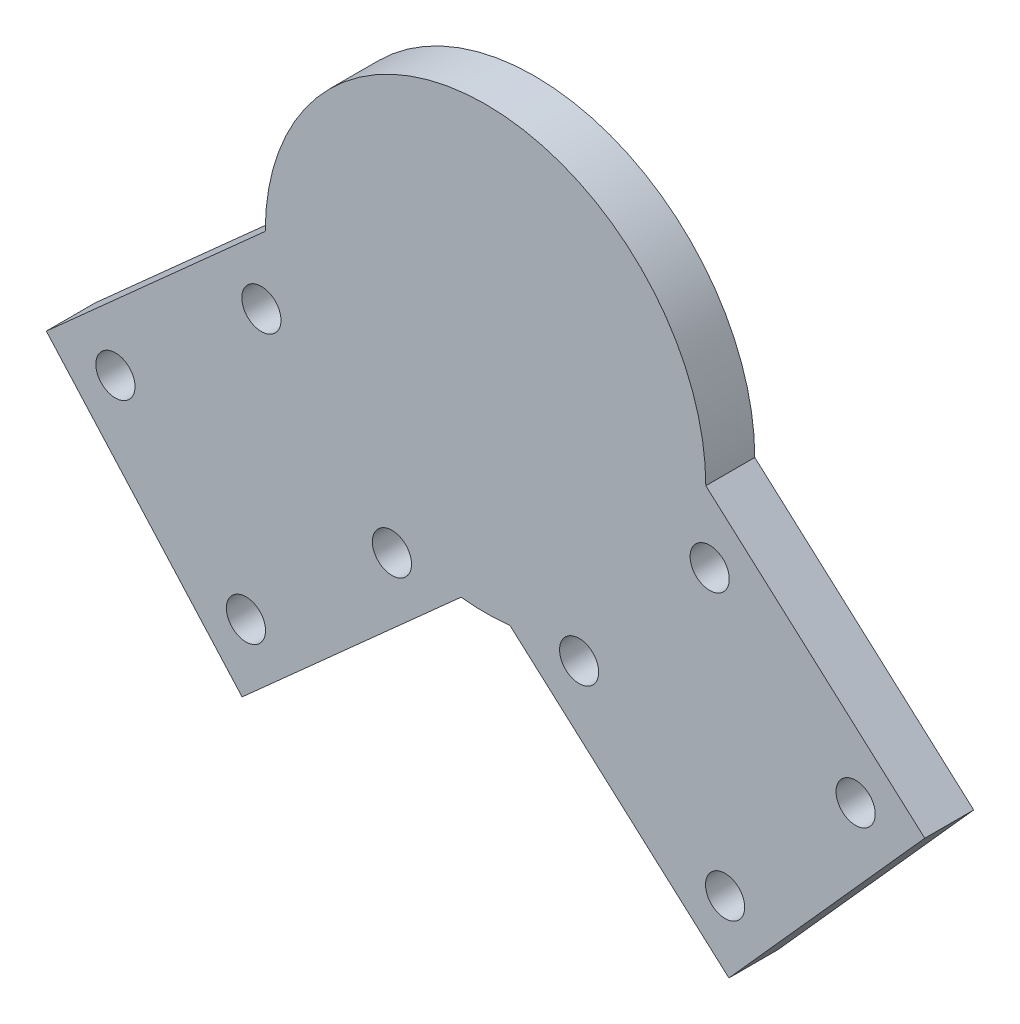
ISO-10303-21;
HEADER;
FILE_DESCRIPTION(('STEP AP214'),'2;1');
FILE_NAME('part.step','',(''),(''),'','','');
FILE_SCHEMA(('AUTOMOTIVE_DESIGN { 1 0 10303 214 1 1 1 1 }'));
ENDSEC;
DATA;
#1=APPLICATION_CONTEXT('core data for automotive mechanical design processes');
#2=APPLICATION_PROTOCOL_DEFINITION('international standard','automotive_design',2000,#1);
#3=PRODUCT_CONTEXT('',#1,'mechanical');
#4=PRODUCT('Part','Part','',(#3));
#5=PRODUCT_RELATED_PRODUCT_CATEGORY('part','',(#4));
#6=PRODUCT_DEFINITION_FORMATION('','',#4);
#7=PRODUCT_DEFINITION_CONTEXT('part definition',#1,'design');
#8=PRODUCT_DEFINITION('design','',#6,#7);
#9=PRODUCT_DEFINITION_SHAPE('','',#8);
#10=(LENGTH_UNIT() NAMED_UNIT(*) SI_UNIT(.MILLI.,.METRE.));
#11=(NAMED_UNIT(*) PLANE_ANGLE_UNIT() SI_UNIT($,.RADIAN.));
#12=(NAMED_UNIT(*) SI_UNIT($,.STERADIAN.) SOLID_ANGLE_UNIT());
#13=UNCERTAINTY_MEASURE_WITH_UNIT(LENGTH_MEASURE(1.E-05),#10,'distance_accuracy_value','');
#14=(GEOMETRIC_REPRESENTATION_CONTEXT(3) GLOBAL_UNCERTAINTY_ASSIGNED_CONTEXT((#13)) GLOBAL_UNIT_ASSIGNED_CONTEXT((#10,
#11,#12)) REPRESENTATION_CONTEXT('',''));
#15=CARTESIAN_POINT('',(0.,0.,0.));
#16=DIRECTION('',(0.,0.,1.));
#17=DIRECTION('',(1.,0.,0.));
#18=AXIS2_PLACEMENT_3D('',#15,#16,#17);
#19=CARTESIAN_POINT('',(-22.5,0.,5.));
#20=DIRECTION('',(0.666666666666667,-0.74535599249993,0.));
#21=DIRECTION('',(0.74535599249993,0.666666666666667,0.));
#22=AXIS2_PLACEMENT_3D('',#19,#20,#21);
#23=PLANE('',#22);
#24=DIRECTION('',(-0.74535599249993,-0.666666666666667,0.));
#25=VECTOR('',#24,1.);
#26=CARTESIAN_POINT('',(-22.5,0.,0.));
#27=LINE('',#26,#25);
#28=CARTESIAN_POINT('',(-22.5,0.,0.));
#29=VERTEX_POINT('',#28);
#30=CARTESIAN_POINT('',(-44.8606797749979,-20.,0.));
#31=VERTEX_POINT('',#30);
#32=EDGE_CURVE('E159',#29,#31,#27,.T.);
#33=ORIENTED_EDGE('',*,*,#32,.T.);
#34=DIRECTION('',(0.,0.,-1.));
#35=VECTOR('',#34,1.);
#36=CARTESIAN_POINT('',(-44.8606797749979,-20.,5.));
#37=LINE('',#36,#35);
#38=CARTESIAN_POINT('',(-44.8606797749979,-20.,5.));
#39=VERTEX_POINT('',#38);
#40=EDGE_CURVE('E200',#39,#31,#37,.T.);
#41=ORIENTED_EDGE('',*,*,#40,.F.);
#42=DIRECTION('',(-0.74535599249993,-0.666666666666667,0.));
#43=VECTOR('',#42,1.);
#44=CARTESIAN_POINT('',(-22.5,0.,5.));
#45=LINE('',#44,#43);
#46=CARTESIAN_POINT('',(-22.5,0.,5.));
#47=VERTEX_POINT('',#46);
#48=EDGE_CURVE('E201',#47,#39,#45,.T.);
#49=ORIENTED_EDGE('',*,*,#48,.F.);
#50=DIRECTION('',(0.,0.,-1.));
#51=VECTOR('',#50,1.);
#52=CARTESIAN_POINT('',(-22.5,0.,5.));
#53=LINE('',#52,#51);
#54=EDGE_CURVE('E85',#47,#29,#53,.T.);
#55=ORIENTED_EDGE('',*,*,#54,.T.);
#56=EDGE_LOOP('',(#33,#41,#49,#55));
#57=FACE_BOUND('',#56,.T.);
#58=ADVANCED_FACE('F74',(#57),#23,.F.);
#59=CARTESIAN_POINT('',(-44.8606797749979,-20.,5.));
#60=DIRECTION('',(0.74535599249993,0.666666666666667,0.));
#61=DIRECTION('',(-0.666666666666667,0.74535599249993,0.));
#62=AXIS2_PLACEMENT_3D('',#59,#60,#61);
#63=PLANE('',#62);
#64=DIRECTION('',(0.666666666666667,-0.74535599249993,0.));
#65=VECTOR('',#64,1.);
#66=CARTESIAN_POINT('',(-44.8606797749979,-20.,0.));
#67=LINE('',#66,#65);
#68=CARTESIAN_POINT('',(-24.8606797749979,-42.3606797749979,0.));
#69=VERTEX_POINT('',#68);
#70=EDGE_CURVE('E210',#31,#69,#67,.T.);
#71=ORIENTED_EDGE('',*,*,#70,.T.);
#72=DIRECTION('',(0.,0.,-1.));
#73=VECTOR('',#72,1.);
#74=CARTESIAN_POINT('',(-24.8606797749979,-42.3606797749979,5.));
#75=LINE('',#74,#73);
#76=CARTESIAN_POINT('',(-24.8606797749979,-42.3606797749979,5.));
#77=VERTEX_POINT('',#76);
#78=EDGE_CURVE('E197',#77,#69,#75,.T.);
#79=ORIENTED_EDGE('',*,*,#78,.F.);
#80=DIRECTION('',(0.666666666666667,-0.74535599249993,0.));
#81=VECTOR('',#80,1.);
#82=CARTESIAN_POINT('',(-44.8606797749979,-20.,5.));
#83=LINE('',#82,#81);
#84=EDGE_CURVE('E220',#39,#77,#83,.T.);
#85=ORIENTED_EDGE('',*,*,#84,.F.);
#86=ORIENTED_EDGE('',*,*,#40,.T.);
#87=EDGE_LOOP('',(#71,#79,#85,#86));
#88=FACE_BOUND('',#87,.T.);
#89=ADVANCED_FACE('F309',(#88),#63,.F.);
#90=CARTESIAN_POINT('',(-2.5,-22.3606797749979,5.));
#91=DIRECTION('',(0.666666666666667,-0.74535599249993,0.));
#92=DIRECTION('',(0.74535599249993,0.666666666666667,0.));
#93=AXIS2_PLACEMENT_3D('',#90,#91,#92);
#94=PLANE('',#93);
#95=DIRECTION('',(-0.74535599249993,-0.666666666666667,0.));
#96=VECTOR('',#95,1.);
#97=CARTESIAN_POINT('',(-2.5,-22.3606797749979,0.));
#98=LINE('',#97,#96);
#99=CARTESIAN_POINT('',(-2.5,-22.3606797749979,0.));
#100=VERTEX_POINT('',#99);
#101=EDGE_CURVE('E150',#100,#69,#98,.T.);
#102=ORIENTED_EDGE('',*,*,#101,.F.);
#103=DIRECTION('',(0.,0.,-1.));
#104=VECTOR('',#103,1.);
#105=CARTESIAN_POINT('',(-2.5,-22.3606797749979,5.));
#106=LINE('',#105,#104);
#107=CARTESIAN_POINT('',(-2.5,-22.3606797749979,5.));
#108=VERTEX_POINT('',#107);
#109=EDGE_CURVE('E12',#108,#100,#106,.T.);
#110=ORIENTED_EDGE('',*,*,#109,.F.);
#111=DIRECTION('',(-0.74535599249993,-0.666666666666667,0.));
#112=VECTOR('',#111,1.);
#113=CARTESIAN_POINT('',(-2.5,-22.3606797749979,5.));
#114=LINE('',#113,#112);
#115=EDGE_CURVE('E209',#108,#77,#114,.T.);
#116=ORIENTED_EDGE('',*,*,#115,.T.);
#117=ORIENTED_EDGE('',*,*,#78,.T.);
#118=EDGE_LOOP('',(#102,#110,#116,#117));
#119=FACE_BOUND('',#118,.T.);
#120=ADVANCED_FACE('F315',(#119),#94,.T.);
#121=CARTESIAN_POINT('',(0.,0.,0.));
#122=DIRECTION('',(0.,0.,1.));
#123=DIRECTION('',(1.,0.,0.));
#124=AXIS2_PLACEMENT_3D('',#121,#122,#123);
#125=PLANE('',#124);
#126=CARTESIAN_POINT('',(-24.4672331458316,-35.3005664791649,0.));
#127=DIRECTION('',(0.,0.,1.));
#128=DIRECTION('',(1.,0.,0.));
#129=AXIS2_PLACEMENT_3D('',#126,#127,#128);
#130=CIRCLE('',#129,2.);
#131=CARTESIAN_POINT('',(-22.4672331458316,-35.3005664791649,0.));
#132=VERTEX_POINT('',#131);
#133=EDGE_CURVE('E239',#132,#132,#130,.T.);
#134=ORIENTED_EDGE('',*,*,#133,.T.);
#135=EDGE_LOOP('',(#134));
#136=FACE_BOUND('',#135,.T.);
#137=CARTESIAN_POINT('',(-37.8005664791649,-20.3934466291663,0.));
#138=DIRECTION('',(0.,0.,1.));
#139=DIRECTION('',(1.,0.,0.));
#140=AXIS2_PLACEMENT_3D('',#137,#138,#139);
#141=CIRCLE('',#140,2.);
#142=CARTESIAN_POINT('',(-35.8005664791649,-20.3934466291663,0.));
#143=VERTEX_POINT('',#142);
#144=EDGE_CURVE('E247',#143,#143,#141,.T.);
#145=ORIENTED_EDGE('',*,*,#144,.T.);
#146=EDGE_LOOP('',(#145));
#147=FACE_BOUND('',#146,.T.);
#148=CARTESIAN_POINT('',(-22.8934466291663,-7.06011329583298,0.));
#149=DIRECTION('',(0.,0.,1.));
#150=DIRECTION('',(1.,0.,0.));
#151=AXIS2_PLACEMENT_3D('',#148,#149,#150);
#152=CIRCLE('',#151,2.);
#153=CARTESIAN_POINT('',(-20.8934466291663,-7.06011329583298,0.));
#154=VERTEX_POINT('',#153);
#155=EDGE_CURVE('E255',#154,#154,#152,.T.);
#156=ORIENTED_EDGE('',*,*,#155,.T.);
#157=EDGE_LOOP('',(#156));
#158=FACE_BOUND('',#157,.T.);
#159=CARTESIAN_POINT('',(-9.56011329583299,-21.9672331458316,0.));
#160=DIRECTION('',(0.,0.,1.));
#161=DIRECTION('',(1.,0.,0.));
#162=AXIS2_PLACEMENT_3D('',#159,#160,#161);
#163=CIRCLE('',#162,2.);
#164=CARTESIAN_POINT('',(-7.56011329583299,-21.9672331458316,0.));
#165=VERTEX_POINT('',#164);
#166=EDGE_CURVE('E263',#165,#165,#163,.T.);
#167=ORIENTED_EDGE('',*,*,#166,.T.);
#168=EDGE_LOOP('',(#167));
#169=FACE_BOUND('',#168,.T.);
#170=CARTESIAN_POINT('',(9.56011329583297,-21.9672331458316,0.));
#171=DIRECTION('',(0.,0.,1.));
#172=DIRECTION('',(1.,0.,0.));
#173=AXIS2_PLACEMENT_3D('',#170,#171,#172);
#174=CIRCLE('',#173,2.);
#175=CARTESIAN_POINT('',(11.560113295833,-21.9672331458316,0.));
#176=VERTEX_POINT('',#175);
#177=EDGE_CURVE('E271',#176,#176,#174,.T.);
#178=ORIENTED_EDGE('',*,*,#177,.T.);
#179=EDGE_LOOP('',(#178));
#180=FACE_BOUND('',#179,.T.);
#181=CARTESIAN_POINT('',(24.4672331458316,-35.3005664791649,0.));
#182=DIRECTION('',(0.,0.,1.));
#183=DIRECTION('',(1.,0.,0.));
#184=AXIS2_PLACEMENT_3D('',#181,#182,#183);
#185=CIRCLE('',#184,2.);
#186=CARTESIAN_POINT('',(26.4672331458316,-35.3005664791649,0.));
#187=VERTEX_POINT('',#186);
#188=EDGE_CURVE('E279',#187,#187,#185,.T.);
#189=ORIENTED_EDGE('',*,*,#188,.T.);
#190=EDGE_LOOP('',(#189));
#191=FACE_BOUND('',#190,.T.);
#192=CARTESIAN_POINT('',(37.8005664791649,-20.3934466291663,0.));
#193=DIRECTION('',(0.,0.,1.));
#194=DIRECTION('',(1.,0.,0.));
#195=AXIS2_PLACEMENT_3D('',#192,#193,#194);
#196=CIRCLE('',#195,2.);
#197=CARTESIAN_POINT('',(39.8005664791649,-20.3934466291663,0.));
#198=VERTEX_POINT('',#197);
#199=EDGE_CURVE('E231',#198,#198,#196,.T.);
#200=ORIENTED_EDGE('',*,*,#199,.T.);
#201=EDGE_LOOP('',(#200));
#202=FACE_BOUND('',#201,.T.);
#203=CARTESIAN_POINT('',(22.8934466291663,-7.06011329583298,0.));
#204=DIRECTION('',(0.,0.,1.));
#205=DIRECTION('',(1.,0.,0.));
#206=AXIS2_PLACEMENT_3D('',#203,#204,#205);
#207=CIRCLE('',#206,2.);
#208=CARTESIAN_POINT('',(24.8934466291663,-7.06011329583298,0.));
#209=VERTEX_POINT('',#208);
#210=EDGE_CURVE('E226',#209,#209,#207,.T.);
#211=ORIENTED_EDGE('',*,*,#210,.T.);
#212=EDGE_LOOP('',(#211));
#213=FACE_BOUND('',#212,.T.);
#214=ORIENTED_EDGE('',*,*,#32,.F.);
#215=CARTESIAN_POINT('',(0.,0.,0.));
#216=DIRECTION('',(0.,0.,1.));
#217=DIRECTION('',(1.,0.,0.));
#218=AXIS2_PLACEMENT_3D('',#215,#216,#217);
#219=CIRCLE('',#218,22.5);
#220=CARTESIAN_POINT('',(22.5,0.,0.));
#221=VERTEX_POINT('',#220);
#222=EDGE_CURVE('E78',#221,#29,#219,.T.);
#223=ORIENTED_EDGE('',*,*,#222,.F.);
#224=DIRECTION('',(0.74535599249993,-0.666666666666667,0.));
#225=VECTOR('',#224,1.);
#226=CARTESIAN_POINT('',(22.5,0.,0.));
#227=LINE('',#226,#225);
#228=CARTESIAN_POINT('',(44.8606797749979,-20.,0.));
#229=VERTEX_POINT('',#228);
#230=EDGE_CURVE('E157',#221,#229,#227,.T.);
#231=ORIENTED_EDGE('',*,*,#230,.T.);
#232=DIRECTION('',(0.666666666666667,0.74535599249993,0.));
#233=VECTOR('',#232,1.);
#234=CARTESIAN_POINT('',(24.8606797749979,-42.3606797749979,0.));
#235=LINE('',#234,#233);
#236=CARTESIAN_POINT('',(24.8606797749979,-42.3606797749979,0.));
#237=VERTEX_POINT('',#236);
#238=EDGE_CURVE('E167',#237,#229,#235,.T.);
#239=ORIENTED_EDGE('',*,*,#238,.F.);
#240=DIRECTION('',(0.74535599249993,-0.666666666666667,0.));
#241=VECTOR('',#240,1.);
#242=CARTESIAN_POINT('',(2.49999999999999,-22.3606797749979,0.));
#243=LINE('',#242,#241);
#244=CARTESIAN_POINT('',(2.49999999999999,-22.3606797749979,0.));
#245=VERTEX_POINT('',#244);
#246=EDGE_CURVE('E171',#245,#237,#243,.T.);
#247=ORIENTED_EDGE('',*,*,#246,.F.);
#248=EDGE_CURVE('E133',#100,#245,#219,.T.);
#249=ORIENTED_EDGE('',*,*,#248,.F.);
#250=ORIENTED_EDGE('',*,*,#101,.T.);
#251=ORIENTED_EDGE('',*,*,#70,.F.);
#252=EDGE_LOOP('',(#214,#223,#231,#239,#247,#249,#250,#251));
#253=FACE_BOUND('',#252,.T.);
#254=ADVANCED_FACE('F155',(#136,#147,#158,#169,#180,#191,#202,#213,#253),#125,.F.);
#255=CARTESIAN_POINT('',(0.,0.,5.));
#256=DIRECTION('',(0.,0.,1.));
#257=DIRECTION('',(1.,0.,0.));
#258=AXIS2_PLACEMENT_3D('',#255,#256,#257);
#259=PLANE('',#258);
#260=CARTESIAN_POINT('',(-24.4672331458316,-35.3005664791649,5.));
#261=DIRECTION('',(0.,0.,1.));
#262=DIRECTION('',(1.,0.,0.));
#263=AXIS2_PLACEMENT_3D('',#260,#261,#262);
#264=CIRCLE('',#263,2.);
#265=CARTESIAN_POINT('',(-22.4672331458316,-35.3005664791649,5.));
#266=VERTEX_POINT('',#265);
#267=EDGE_CURVE('E235',#266,#266,#264,.T.);
#268=ORIENTED_EDGE('',*,*,#267,.F.);
#269=EDGE_LOOP('',(#268));
#270=FACE_BOUND('',#269,.T.);
#271=CARTESIAN_POINT('',(-37.8005664791649,-20.3934466291663,5.));
#272=DIRECTION('',(0.,0.,1.));
#273=DIRECTION('',(1.,0.,0.));
#274=AXIS2_PLACEMENT_3D('',#271,#272,#273);
#275=CIRCLE('',#274,2.);
#276=CARTESIAN_POINT('',(-35.8005664791649,-20.3934466291663,5.));
#277=VERTEX_POINT('',#276);
#278=EDGE_CURVE('E243',#277,#277,#275,.T.);
#279=ORIENTED_EDGE('',*,*,#278,.F.);
#280=EDGE_LOOP('',(#279));
#281=FACE_BOUND('',#280,.T.);
#282=CARTESIAN_POINT('',(-22.8934466291663,-7.06011329583298,5.));
#283=DIRECTION('',(0.,0.,1.));
#284=DIRECTION('',(1.,0.,0.));
#285=AXIS2_PLACEMENT_3D('',#282,#283,#284);
#286=CIRCLE('',#285,2.);
#287=CARTESIAN_POINT('',(-20.8934466291663,-7.06011329583298,5.));
#288=VERTEX_POINT('',#287);
#289=EDGE_CURVE('E251',#288,#288,#286,.T.);
#290=ORIENTED_EDGE('',*,*,#289,.F.);
#291=EDGE_LOOP('',(#290));
#292=FACE_BOUND('',#291,.T.);
#293=CARTESIAN_POINT('',(-9.56011329583299,-21.9672331458316,5.));
#294=DIRECTION('',(0.,0.,1.));
#295=DIRECTION('',(1.,0.,0.));
#296=AXIS2_PLACEMENT_3D('',#293,#294,#295);
#297=CIRCLE('',#296,2.);
#298=CARTESIAN_POINT('',(-7.56011329583299,-21.9672331458316,5.));
#299=VERTEX_POINT('',#298);
#300=EDGE_CURVE('E259',#299,#299,#297,.T.);
#301=ORIENTED_EDGE('',*,*,#300,.F.);
#302=EDGE_LOOP('',(#301));
#303=FACE_BOUND('',#302,.T.);
#304=CARTESIAN_POINT('',(9.56011329583297,-21.9672331458316,5.));
#305=DIRECTION('',(0.,0.,1.));
#306=DIRECTION('',(1.,0.,0.));
#307=AXIS2_PLACEMENT_3D('',#304,#305,#306);
#308=CIRCLE('',#307,2.);
#309=CARTESIAN_POINT('',(11.560113295833,-21.9672331458316,5.));
#310=VERTEX_POINT('',#309);
#311=EDGE_CURVE('E267',#310,#310,#308,.T.);
#312=ORIENTED_EDGE('',*,*,#311,.F.);
#313=EDGE_LOOP('',(#312));
#314=FACE_BOUND('',#313,.T.);
#315=CARTESIAN_POINT('',(24.4672331458316,-35.3005664791649,5.));
#316=DIRECTION('',(0.,0.,1.));
#317=DIRECTION('',(1.,0.,0.));
#318=AXIS2_PLACEMENT_3D('',#315,#316,#317);
#319=CIRCLE('',#318,2.);
#320=CARTESIAN_POINT('',(26.4672331458316,-35.3005664791649,5.));
#321=VERTEX_POINT('',#320);
#322=EDGE_CURVE('E275',#321,#321,#319,.T.);
#323=ORIENTED_EDGE('',*,*,#322,.F.);
#324=EDGE_LOOP('',(#323));
#325=FACE_BOUND('',#324,.T.);
#326=CARTESIAN_POINT('',(37.8005664791649,-20.3934466291663,5.));
#327=DIRECTION('',(0.,0.,1.));
#328=DIRECTION('',(1.,0.,0.));
#329=AXIS2_PLACEMENT_3D('',#326,#327,#328);
#330=CIRCLE('',#329,2.);
#331=CARTESIAN_POINT('',(39.8005664791649,-20.3934466291663,5.));
#332=VERTEX_POINT('',#331);
#333=EDGE_CURVE('E283',#332,#332,#330,.T.);
#334=ORIENTED_EDGE('',*,*,#333,.F.);
#335=EDGE_LOOP('',(#334));
#336=FACE_BOUND('',#335,.T.);
#337=CARTESIAN_POINT('',(22.8934466291663,-7.06011329583298,5.));
#338=DIRECTION('',(0.,0.,1.));
#339=DIRECTION('',(1.,0.,0.));
#340=AXIS2_PLACEMENT_3D('',#337,#338,#339);
#341=CIRCLE('',#340,2.);
#342=CARTESIAN_POINT('',(24.8934466291663,-7.06011329583298,5.));
#343=VERTEX_POINT('',#342);
#344=EDGE_CURVE('E230',#343,#343,#341,.T.);
#345=ORIENTED_EDGE('',*,*,#344,.F.);
#346=EDGE_LOOP('',(#345));
#347=FACE_BOUND('',#346,.T.);
#348=ORIENTED_EDGE('',*,*,#115,.F.);
#349=CARTESIAN_POINT('',(0.,0.,5.));
#350=DIRECTION('',(0.,0.,1.));
#351=DIRECTION('',(1.,0.,0.));
#352=AXIS2_PLACEMENT_3D('',#349,#350,#351);
#353=CIRCLE('',#352,22.5);
#354=CARTESIAN_POINT('',(2.49999999999999,-22.3606797749979,5.));
#355=VERTEX_POINT('',#354);
#356=EDGE_CURVE('E161',#108,#355,#353,.T.);
#357=ORIENTED_EDGE('',*,*,#356,.T.);
#358=DIRECTION('',(0.74535599249993,-0.666666666666667,0.));
#359=VECTOR('',#358,1.);
#360=CARTESIAN_POINT('',(2.49999999999999,-22.3606797749979,5.));
#361=LINE('',#360,#359);
#362=CARTESIAN_POINT('',(24.8606797749979,-42.3606797749979,5.));
#363=VERTEX_POINT('',#362);
#364=EDGE_CURVE('E174',#355,#363,#361,.T.);
#365=ORIENTED_EDGE('',*,*,#364,.T.);
#366=DIRECTION('',(0.666666666666667,0.74535599249993,0.));
#367=VECTOR('',#366,1.);
#368=CARTESIAN_POINT('',(24.8606797749979,-42.3606797749979,5.));
#369=LINE('',#368,#367);
#370=CARTESIAN_POINT('',(44.8606797749979,-20.,5.));
#371=VERTEX_POINT('',#370);
#372=EDGE_CURVE('E188',#363,#371,#369,.T.);
#373=ORIENTED_EDGE('',*,*,#372,.T.);
#374=DIRECTION('',(0.74535599249993,-0.666666666666667,0.));
#375=VECTOR('',#374,1.);
#376=CARTESIAN_POINT('',(22.5,0.,5.));
#377=LINE('',#376,#375);
#378=CARTESIAN_POINT('',(22.5,0.,5.));
#379=VERTEX_POINT('',#378);
#380=EDGE_CURVE('E178',#379,#371,#377,.T.);
#381=ORIENTED_EDGE('',*,*,#380,.F.);
#382=EDGE_CURVE('E144',#379,#47,#353,.T.);
#383=ORIENTED_EDGE('',*,*,#382,.T.);
#384=ORIENTED_EDGE('',*,*,#48,.T.);
#385=ORIENTED_EDGE('',*,*,#84,.T.);
#386=EDGE_LOOP('',(#348,#357,#365,#373,#381,#383,#384,#385));
#387=FACE_BOUND('',#386,.T.);
#388=ADVANCED_FACE('F329',(#270,#281,#292,#303,#314,#325,#336,#347,#387),#259,.T.);
#389=CARTESIAN_POINT('',(24.8606797749979,-42.3606797749979,5.));
#390=DIRECTION('',(-0.74535599249993,0.666666666666667,0.));
#391=DIRECTION('',(-0.666666666666667,-0.74535599249993,0.));
#392=AXIS2_PLACEMENT_3D('',#389,#390,#391);
#393=PLANE('',#392);
#394=ORIENTED_EDGE('',*,*,#238,.T.);
#395=DIRECTION('',(0.,0.,-1.));
#396=VECTOR('',#395,1.);
#397=CARTESIAN_POINT('',(44.8606797749979,-20.,5.));
#398=LINE('',#397,#396);
#399=EDGE_CURVE('E164',#371,#229,#398,.T.);
#400=ORIENTED_EDGE('',*,*,#399,.F.);
#401=ORIENTED_EDGE('',*,*,#372,.F.);
#402=DIRECTION('',(0.,0.,-1.));
#403=VECTOR('',#402,1.);
#404=CARTESIAN_POINT('',(24.8606797749979,-42.3606797749979,5.));
#405=LINE('',#404,#403);
#406=EDGE_CURVE('E182',#363,#237,#405,.T.);
#407=ORIENTED_EDGE('',*,*,#406,.T.);
#408=EDGE_LOOP('',(#394,#400,#401,#407));
#409=FACE_BOUND('',#408,.T.);
#410=ADVANCED_FACE('F326',(#409),#393,.F.);
#411=CARTESIAN_POINT('',(2.49999999999999,-22.3606797749979,5.));
#412=DIRECTION('',(0.666666666666667,0.74535599249993,0.));
#413=DIRECTION('',(-0.74535599249993,0.666666666666667,0.));
#414=AXIS2_PLACEMENT_3D('',#411,#412,#413);
#415=PLANE('',#414);
#416=ORIENTED_EDGE('',*,*,#246,.T.);
#417=ORIENTED_EDGE('',*,*,#406,.F.);
#418=ORIENTED_EDGE('',*,*,#364,.F.);
#419=DIRECTION('',(0.,0.,-1.));
#420=VECTOR('',#419,1.);
#421=CARTESIAN_POINT('',(2.49999999999999,-22.3606797749979,5.));
#422=LINE('',#421,#420);
#423=EDGE_CURVE('E151',#355,#245,#422,.T.);
#424=ORIENTED_EDGE('',*,*,#423,.T.);
#425=EDGE_LOOP('',(#416,#417,#418,#424));
#426=FACE_BOUND('',#425,.T.);
#427=ADVANCED_FACE('F323',(#426),#415,.F.);
#428=CARTESIAN_POINT('',(22.5,0.,5.));
#429=DIRECTION('',(0.666666666666667,0.74535599249993,0.));
#430=DIRECTION('',(-0.74535599249993,0.666666666666667,0.));
#431=AXIS2_PLACEMENT_3D('',#428,#429,#430);
#432=PLANE('',#431);
#433=ORIENTED_EDGE('',*,*,#230,.F.);
#434=DIRECTION('',(0.,0.,-1.));
#435=VECTOR('',#434,1.);
#436=CARTESIAN_POINT('',(22.5,0.,5.));
#437=LINE('',#436,#435);
#438=EDGE_CURVE('E139',#379,#221,#437,.T.);
#439=ORIENTED_EDGE('',*,*,#438,.F.);
#440=ORIENTED_EDGE('',*,*,#380,.T.);
#441=ORIENTED_EDGE('',*,*,#399,.T.);
#442=EDGE_LOOP('',(#433,#439,#440,#441));
#443=FACE_BOUND('',#442,.T.);
#444=ADVANCED_FACE('F162',(#443),#432,.T.);
#445=CARTESIAN_POINT('',(0.,0.,5.));
#446=DIRECTION('',(0.,0.,-1.));
#447=DIRECTION('',(-1.,0.,0.));
#448=AXIS2_PLACEMENT_3D('',#445,#446,#447);
#449=CYLINDRICAL_SURFACE('',#448,22.5);
#450=ORIENTED_EDGE('',*,*,#109,.T.);
#451=ORIENTED_EDGE('',*,*,#248,.T.);
#452=ORIENTED_EDGE('',*,*,#423,.F.);
#453=ORIENTED_EDGE('',*,*,#356,.F.);
#454=EDGE_LOOP('',(#450,#451,#452,#453));
#455=FACE_BOUND('',#454,.T.);
#456=ADVANCED_FACE('F76',(#455),#449,.T.);
#457=ORIENTED_EDGE('',*,*,#222,.T.);
#458=ORIENTED_EDGE('',*,*,#54,.F.);
#459=ORIENTED_EDGE('',*,*,#382,.F.);
#460=ORIENTED_EDGE('',*,*,#438,.T.);
#461=EDGE_LOOP('',(#457,#458,#459,#460));
#462=FACE_BOUND('',#461,.T.);
#463=ADVANCED_FACE('F141',(#462),#449,.T.);
#464=CARTESIAN_POINT('',(22.8934466291663,-7.06011329583298,5.));
#465=DIRECTION('',(0.,0.,-1.));
#466=DIRECTION('',(-1.,0.,0.));
#467=AXIS2_PLACEMENT_3D('',#464,#465,#466);
#468=CYLINDRICAL_SURFACE('',#467,2.);
#469=ORIENTED_EDGE('',*,*,#344,.T.);
#470=EDGE_LOOP('',(#469));
#471=FACE_BOUND('',#470,.T.);
#472=ORIENTED_EDGE('',*,*,#210,.F.);
#473=EDGE_LOOP('',(#472));
#474=FACE_BOUND('',#473,.T.);
#475=ADVANCED_FACE('F296',(#471,#474),#468,.F.);
#476=CARTESIAN_POINT('',(37.8005664791649,-20.3934466291663,5.));
#477=DIRECTION('',(0.,0.,-1.));
#478=DIRECTION('',(-1.,0.,0.));
#479=AXIS2_PLACEMENT_3D('',#476,#477,#478);
#480=CYLINDRICAL_SURFACE('',#479,2.);
#481=ORIENTED_EDGE('',*,*,#333,.T.);
#482=EDGE_LOOP('',(#481));
#483=FACE_BOUND('',#482,.T.);
#484=ORIENTED_EDGE('',*,*,#199,.F.);
#485=EDGE_LOOP('',(#484));
#486=FACE_BOUND('',#485,.T.);
#487=ADVANCED_FACE('F293',(#483,#486),#480,.F.);
#488=CARTESIAN_POINT('',(24.4672331458316,-35.3005664791649,5.));
#489=DIRECTION('',(0.,0.,-1.));
#490=DIRECTION('',(-1.,0.,0.));
#491=AXIS2_PLACEMENT_3D('',#488,#489,#490);
#492=CYLINDRICAL_SURFACE('',#491,2.);
#493=ORIENTED_EDGE('',*,*,#322,.T.);
#494=EDGE_LOOP('',(#493));
#495=FACE_BOUND('',#494,.T.);
#496=ORIENTED_EDGE('',*,*,#188,.F.);
#497=EDGE_LOOP('',(#496));
#498=FACE_BOUND('',#497,.T.);
#499=ADVANCED_FACE('F295',(#495,#498),#492,.F.);
#500=CARTESIAN_POINT('',(9.56011329583297,-21.9672331458316,5.));
#501=DIRECTION('',(0.,0.,-1.));
#502=DIRECTION('',(-1.,0.,0.));
#503=AXIS2_PLACEMENT_3D('',#500,#501,#502);
#504=CYLINDRICAL_SURFACE('',#503,2.);
#505=ORIENTED_EDGE('',*,*,#311,.T.);
#506=EDGE_LOOP('',(#505));
#507=FACE_BOUND('',#506,.T.);
#508=ORIENTED_EDGE('',*,*,#177,.F.);
#509=EDGE_LOOP('',(#508));
#510=FACE_BOUND('',#509,.T.);
#511=ADVANCED_FACE('F303',(#507,#510),#504,.F.);
#512=CARTESIAN_POINT('',(-9.56011329583299,-21.9672331458316,5.));
#513=DIRECTION('',(0.,0.,-1.));
#514=DIRECTION('',(-1.,0.,0.));
#515=AXIS2_PLACEMENT_3D('',#512,#513,#514);
#516=CYLINDRICAL_SURFACE('',#515,2.);
#517=ORIENTED_EDGE('',*,*,#300,.T.);
#518=EDGE_LOOP('',(#517));
#519=FACE_BOUND('',#518,.T.);
#520=ORIENTED_EDGE('',*,*,#166,.F.);
#521=EDGE_LOOP('',(#520));
#522=FACE_BOUND('',#521,.T.);
#523=ADVANCED_FACE('F367',(#519,#522),#516,.F.);
#524=CARTESIAN_POINT('',(-22.8934466291663,-7.06011329583298,5.));
#525=DIRECTION('',(0.,0.,-1.));
#526=DIRECTION('',(-1.,0.,0.));
#527=AXIS2_PLACEMENT_3D('',#524,#525,#526);
#528=CYLINDRICAL_SURFACE('',#527,2.);
#529=ORIENTED_EDGE('',*,*,#289,.T.);
#530=EDGE_LOOP('',(#529));
#531=FACE_BOUND('',#530,.T.);
#532=ORIENTED_EDGE('',*,*,#155,.F.);
#533=EDGE_LOOP('',(#532));
#534=FACE_BOUND('',#533,.T.);
#535=ADVANCED_FACE('F363',(#531,#534),#528,.F.);
#536=CARTESIAN_POINT('',(-37.8005664791649,-20.3934466291663,5.));
#537=DIRECTION('',(0.,0.,-1.));
#538=DIRECTION('',(-1.,0.,0.));
#539=AXIS2_PLACEMENT_3D('',#536,#537,#538);
#540=CYLINDRICAL_SURFACE('',#539,2.);
#541=ORIENTED_EDGE('',*,*,#278,.T.);
#542=EDGE_LOOP('',(#541));
#543=FACE_BOUND('',#542,.T.);
#544=ORIENTED_EDGE('',*,*,#144,.F.);
#545=EDGE_LOOP('',(#544));
#546=FACE_BOUND('',#545,.T.);
#547=ADVANCED_FACE('F359',(#543,#546),#540,.F.);
#548=CARTESIAN_POINT('',(-24.4672331458316,-35.3005664791649,5.));
#549=DIRECTION('',(0.,0.,-1.));
#550=DIRECTION('',(-1.,0.,0.));
#551=AXIS2_PLACEMENT_3D('',#548,#549,#550);
#552=CYLINDRICAL_SURFACE('',#551,2.);
#553=ORIENTED_EDGE('',*,*,#267,.T.);
#554=EDGE_LOOP('',(#553));
#555=FACE_BOUND('',#554,.T.);
#556=ORIENTED_EDGE('',*,*,#133,.F.);
#557=EDGE_LOOP('',(#556));
#558=FACE_BOUND('',#557,.T.);
#559=ADVANCED_FACE('F356',(#555,#558),#552,.F.);
#560=CLOSED_SHELL('',(#58,#89,#120,#254,#388,#410,#427,#444,#456,#463,#475,#487,#499,#511,#523,
#535,#547,#559));
#561=MANIFOLD_SOLID_BREP('B2',#560);
#562=ADVANCED_BREP_SHAPE_REPRESENTATION('',(#18,#561),#14);
#563=SHAPE_DEFINITION_REPRESENTATION(#9,#562);
ENDSEC;
END-ISO-10303-21;
